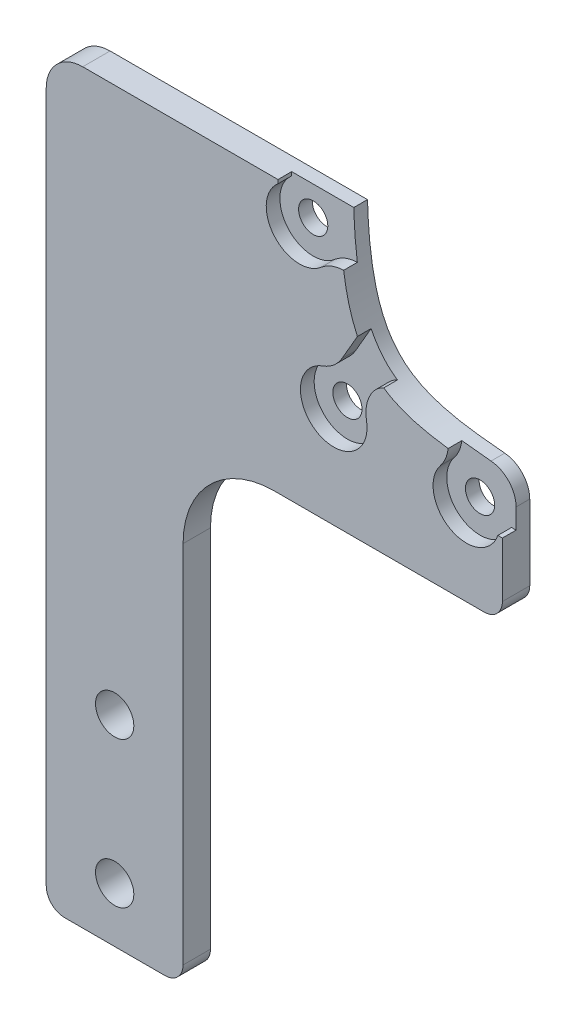
ISO-10303-21;
HEADER;
FILE_DESCRIPTION(('STEP AP214'),'2;1');
FILE_NAME('part.step','',(''),(''),'','','');
FILE_SCHEMA(('AUTOMOTIVE_DESIGN { 1 0 10303 214 1 1 1 1 }'));
ENDSEC;
DATA;
#1=APPLICATION_CONTEXT('core data for automotive mechanical design processes');
#2=APPLICATION_PROTOCOL_DEFINITION('international standard','automotive_design',2000,#1);
#3=PRODUCT_CONTEXT('',#1,'mechanical');
#4=PRODUCT('Part','Part','',(#3));
#5=PRODUCT_RELATED_PRODUCT_CATEGORY('part','',(#4));
#6=PRODUCT_DEFINITION_FORMATION('','',#4);
#7=PRODUCT_DEFINITION_CONTEXT('part definition',#1,'design');
#8=PRODUCT_DEFINITION('design','',#6,#7);
#9=PRODUCT_DEFINITION_SHAPE('','',#8);
#10=(LENGTH_UNIT() NAMED_UNIT(*) SI_UNIT(.MILLI.,.METRE.));
#11=(NAMED_UNIT(*) PLANE_ANGLE_UNIT() SI_UNIT($,.RADIAN.));
#12=(NAMED_UNIT(*) SI_UNIT($,.STERADIAN.) SOLID_ANGLE_UNIT());
#13=UNCERTAINTY_MEASURE_WITH_UNIT(LENGTH_MEASURE(1.E-05),#10,'distance_accuracy_value','');
#14=(GEOMETRIC_REPRESENTATION_CONTEXT(3) GLOBAL_UNCERTAINTY_ASSIGNED_CONTEXT((#13)) GLOBAL_UNIT_ASSIGNED_CONTEXT((#10,
#11,#12)) REPRESENTATION_CONTEXT('',''));
#15=CARTESIAN_POINT('',(0.,0.,0.));
#16=DIRECTION('',(0.,0.,1.));
#17=DIRECTION('',(1.,0.,0.));
#18=AXIS2_PLACEMENT_3D('',#15,#16,#17);
#19=CARTESIAN_POINT('',(-4.84810144085756,-0.321505966021562,-3.));
#20=CARTESIAN_POINT('',(-11.5337030803781,0.191019867929595,-3.));
#21=CARTESIAN_POINT('',(-20.1262235232757,0.876298033798934,-3.));
#22=CARTESIAN_POINT('',(-22.4429144832832,9.99430756418891,-3.));
#23=CARTESIAN_POINT('',(-22.6342920073783,16.445697007021,-3.));
#24=B_SPLINE_CURVE_WITH_KNOTS('',3,(#19,#20,#21,#22,#23),.UNSPECIFIED.,.F.,.F.,(4,1,4),(0.,
0.555464142141555,1.),.UNSPECIFIED.);
#25=DIRECTION('',(0.,0.,1.));
#26=VECTOR('',#25,1.);
#27=SURFACE_OF_LINEAR_EXTRUSION('',#24,#26);
#28=DIRECTION('',(0.,0.,1.));
#29=VECTOR('',#28,1.);
#30=CARTESIAN_POINT('',(-22.6342920073783,16.445697007021,-3.));
#31=LINE('',#30,#29);
#32=CARTESIAN_POINT('',(-22.6342920073783,16.445697007021,-3.));
#33=VERTEX_POINT('',#32);
#34=CARTESIAN_POINT('',(-22.6342920073783,16.445697007021,-1.5));
#35=VERTEX_POINT('',#34);
#36=EDGE_CURVE('E265',#33,#35,#31,.T.);
#37=ORIENTED_EDGE('',*,*,#36,.T.);
#38=CARTESIAN_POINT('',(-4.84810144085756,-0.321505966021562,-1.5));
#39=CARTESIAN_POINT('',(-11.5337030803781,0.191019867929595,-1.5));
#40=CARTESIAN_POINT('',(-20.1262235232757,0.876298033798934,-1.5));
#41=CARTESIAN_POINT('',(-22.4429144832832,9.99430756418891,-1.5));
#42=CARTESIAN_POINT('',(-22.6342920073783,16.445697007021,-1.5));
#43=B_SPLINE_CURVE_WITH_KNOTS('',3,(#38,#39,#40,#41,#42),.UNSPECIFIED.,.F.,.F.,(4,1,4),(0.,
0.555464142141555,1.),.UNSPECIFIED.);
#44=CARTESIAN_POINT('',(-22.2476020781494,11.4284929107981,-1.5));
#45=VERTEX_POINT('',#44);
#46=EDGE_CURVE('E340',#45,#35,#43,.T.);
#47=ORIENTED_EDGE('',*,*,#46,.F.);
#48=DIRECTION('',(0.,0.,1.));
#49=VECTOR('',#48,1.);
#50=CARTESIAN_POINT('',(-22.2476020781494,11.4284929107981,-3.));
#51=LINE('',#50,#49);
#52=CARTESIAN_POINT('',(-22.2476020781494,11.4284929107981,0.));
#53=VERTEX_POINT('',#52);
#54=EDGE_CURVE('E738',#53,#45,#51,.F.);
#55=ORIENTED_EDGE('',*,*,#54,.F.);
#56=CARTESIAN_POINT('',(-4.84810144085756,-0.321505966021562,0.));
#57=CARTESIAN_POINT('',(-11.5337030803781,0.191019867929595,0.));
#58=CARTESIAN_POINT('',(-20.1262235232757,0.876298033798934,0.));
#59=CARTESIAN_POINT('',(-22.4429144832832,9.99430756418891,0.));
#60=CARTESIAN_POINT('',(-22.6342920073783,16.445697007021,0.));
#61=B_SPLINE_CURVE_WITH_KNOTS('',3,(#56,#57,#58,#59,#60),.UNSPECIFIED.,.F.,.F.,(4,1,4),(0.,
0.555464142141555,1.),.UNSPECIFIED.);
#62=CARTESIAN_POINT('',(-20.7354963631146,5.90148701654422,0.));
#63=VERTEX_POINT('',#62);
#64=EDGE_CURVE('E248',#63,#53,#61,.T.);
#65=ORIENTED_EDGE('',*,*,#64,.F.);
#66=DIRECTION('',(0.,0.,1.));
#67=VECTOR('',#66,1.);
#68=CARTESIAN_POINT('',(-20.7354963682505,5.90148702716351,-3.));
#69=LINE('',#68,#67);
#70=CARTESIAN_POINT('',(-20.7354963715636,5.90148702142502,-1.5));
#71=VERTEX_POINT('',#70);
#72=EDGE_CURVE('E55',#71,#63,#69,.T.);
#73=ORIENTED_EDGE('',*,*,#72,.F.);
#74=CARTESIAN_POINT('',(-17.8551788077362,2.4588214028567,-1.5));
#75=VERTEX_POINT('',#74);
#76=EDGE_CURVE('E339',#75,#71,#43,.T.);
#77=ORIENTED_EDGE('',*,*,#76,.F.);
#78=DIRECTION('',(0.,0.,1.));
#79=VECTOR('',#78,1.);
#80=CARTESIAN_POINT('',(-17.8551788077362,2.4588214028567,-3.));
#81=LINE('',#80,#79);
#82=CARTESIAN_POINT('',(-17.8551788077362,2.4588214028567,0.));
#83=VERTEX_POINT('',#82);
#84=EDGE_CURVE('E741',#83,#75,#81,.F.);
#85=ORIENTED_EDGE('',*,*,#84,.F.);
#86=CARTESIAN_POINT('',(-10.7957714165131,0.235027934056742,0.));
#87=VERTEX_POINT('',#86);
#88=EDGE_CURVE('E243',#87,#83,#61,.T.);
#89=ORIENTED_EDGE('',*,*,#88,.F.);
#90=DIRECTION('',(0.,0.,1.));
#91=VECTOR('',#90,1.);
#92=CARTESIAN_POINT('',(-10.7957714165131,0.235027934056742,-3.));
#93=LINE('',#92,#91);
#94=CARTESIAN_POINT('',(-10.7957714165131,0.235027934056742,-1.5));
#95=VERTEX_POINT('',#94);
#96=EDGE_CURVE('E335',#95,#87,#93,.T.);
#97=ORIENTED_EDGE('',*,*,#96,.F.);
#98=CARTESIAN_POINT('',(-7.58987805858031,-0.102501025391033,-1.5));
#99=VERTEX_POINT('',#98);
#100=EDGE_CURVE('E324',#99,#95,#43,.T.);
#101=ORIENTED_EDGE('',*,*,#100,.F.);
#102=DIRECTION('',(0.,0.,1.));
#103=VECTOR('',#102,1.);
#104=CARTESIAN_POINT('',(-7.58987805858034,-0.10250102539103,0.));
#105=LINE('',#104,#103);
#106=CARTESIAN_POINT('',(-7.58987805858031,-0.102501025391033,-3.));
#107=VERTEX_POINT('',#106);
#108=EDGE_CURVE('E308',#99,#107,#105,.F.);
#109=ORIENTED_EDGE('',*,*,#108,.T.);
#110=EDGE_CURVE('E264',#107,#33,#24,.T.);
#111=ORIENTED_EDGE('',*,*,#110,.T.);
#112=EDGE_LOOP('',(#37,#47,#55,#65,#73,#77,#85,#89,#97,#101,#109,#111));
#113=FACE_BOUND('',#112,.T.);
#114=ADVANCED_FACE('F32',(#113),#27,.T.);
#115=CARTESIAN_POINT('',(-54.8481014408576,16.445697007021,-3.));
#116=DIRECTION('',(0.,1.,0.));
#117=DIRECTION('',(0.,0.,1.));
#118=AXIS2_PLACEMENT_3D('',#115,#116,#117);
#119=PLANE('',#118);
#120=DIRECTION('',(0.,0.,1.));
#121=VECTOR('',#120,1.);
#122=CARTESIAN_POINT('',(-29.4444367034377,16.445697007021,-3.));
#123=LINE('',#122,#121);
#124=CARTESIAN_POINT('',(-29.4444367034377,16.445697007021,-1.5));
#125=VERTEX_POINT('',#124);
#126=CARTESIAN_POINT('',(-29.4444367034377,16.445697007021,0.));
#127=VERTEX_POINT('',#126);
#128=EDGE_CURVE('E217',#125,#127,#123,.T.);
#129=ORIENTED_EDGE('',*,*,#128,.F.);
#130=DIRECTION('',(-1.,0.,0.));
#131=VECTOR('',#130,1.);
#132=CARTESIAN_POINT('',(-54.8481014408576,16.445697007021,-1.5));
#133=LINE('',#132,#131);
#134=EDGE_CURVE('E336',#35,#125,#133,.T.);
#135=ORIENTED_EDGE('',*,*,#134,.F.);
#136=ORIENTED_EDGE('',*,*,#36,.F.);
#137=DIRECTION('',(-1.,0.,0.));
#138=VECTOR('',#137,1.);
#139=CARTESIAN_POINT('',(-54.8481014408576,16.445697007021,-3.));
#140=LINE('',#139,#138);
#141=CARTESIAN_POINT('',(-50.8481014408576,16.445697007021,-3.));
#142=VERTEX_POINT('',#141);
#143=EDGE_CURVE('E365',#33,#142,#140,.T.);
#144=ORIENTED_EDGE('',*,*,#143,.T.);
#145=DIRECTION('',(0.,0.,1.));
#146=VECTOR('',#145,1.);
#147=CARTESIAN_POINT('',(-50.8481014408576,16.445697007021,-3.));
#148=LINE('',#147,#146);
#149=CARTESIAN_POINT('',(-50.8481014408576,16.445697007021,0.));
#150=VERTEX_POINT('',#149);
#151=EDGE_CURVE('E241',#142,#150,#148,.T.);
#152=ORIENTED_EDGE('',*,*,#151,.T.);
#153=DIRECTION('',(-1.,0.,0.));
#154=VECTOR('',#153,1.);
#155=CARTESIAN_POINT('',(-54.8481014408576,16.445697007021,0.));
#156=LINE('',#155,#154);
#157=EDGE_CURVE('E231',#127,#150,#156,.T.);
#158=ORIENTED_EDGE('',*,*,#157,.F.);
#159=EDGE_LOOP('',(#129,#135,#136,#144,#152,#158));
#160=FACE_BOUND('',#159,.T.);
#161=ADVANCED_FACE('F238',(#160),#119,.T.);
#162=CARTESIAN_POINT('',(-7.84810144085759,-3.09136714565224,-1.5));
#163=DIRECTION('',(0.,0.,1.));
#164=DIRECTION('',(1.,0.,0.));
#165=AXIS2_PLACEMENT_3D('',#162,#163,#164);
#166=CYLINDRICAL_SURFACE('',#165,3.);
#167=CARTESIAN_POINT('',(-7.84810144085759,-3.09136714565224,-1.5));
#168=DIRECTION('',(0.,0.,-1.));
#169=DIRECTION('',(-1.,0.,0.));
#170=AXIS2_PLACEMENT_3D('',#167,#168,#169);
#171=CIRCLE('',#170,3.);
#172=CARTESIAN_POINT('',(-4.84810144085759,-3.09136714565224,-1.5));
#173=VERTEX_POINT('',#172);
#174=EDGE_CURVE('E40',#173,#99,#171,.F.);
#175=ORIENTED_EDGE('',*,*,#174,.F.);
#176=DIRECTION('',(0.,0.,1.));
#177=VECTOR('',#176,1.);
#178=CARTESIAN_POINT('',(-4.84810144085759,-3.09136714565224,-3.));
#179=LINE('',#178,#177);
#180=CARTESIAN_POINT('',(-4.84810144085759,-3.09136714565224,-3.));
#181=VERTEX_POINT('',#180);
#182=EDGE_CURVE('E305',#181,#173,#179,.T.);
#183=ORIENTED_EDGE('',*,*,#182,.F.);
#184=CARTESIAN_POINT('',(-7.84810144085759,-3.09136714565224,-3.));
#185=DIRECTION('',(0.,0.,-1.));
#186=DIRECTION('',(-1.,0.,0.));
#187=AXIS2_PLACEMENT_3D('',#184,#185,#186);
#188=CIRCLE('',#187,3.);
#189=EDGE_CURVE('E310',#107,#181,#188,.T.);
#190=ORIENTED_EDGE('',*,*,#189,.F.);
#191=ORIENTED_EDGE('',*,*,#108,.F.);
#192=EDGE_LOOP('',(#175,#183,#190,#191));
#193=FACE_BOUND('',#192,.T.);
#194=ADVANCED_FACE('F342',(#193),#166,.T.);
#195=CARTESIAN_POINT('',(-18.2354484517116,2.73583518356467,0.));
#196=DIRECTION('',(0.,0.,-1.));
#197=DIRECTION('',(-1.,0.,0.));
#198=AXIS2_PLACEMENT_3D('',#195,#196,#197);
#199=PLANE('',#198);
#200=CARTESIAN_POINT('',(-47.3481014408576,-43.3215059660216,0.));
#201=DIRECTION('',(0.,0.,1.));
#202=DIRECTION('',(1.,0.,0.));
#203=AXIS2_PLACEMENT_3D('',#200,#201,#202);
#204=CIRCLE('',#203,2.1);
#205=CARTESIAN_POINT('',(-45.2481014408576,-43.3215059660216,0.));
#206=VERTEX_POINT('',#205);
#207=EDGE_CURVE('E745',#206,#206,#204,.T.);
#208=ORIENTED_EDGE('',*,*,#207,.F.);
#209=EDGE_LOOP('',(#208));
#210=FACE_BOUND('',#209,.T.);
#211=CARTESIAN_POINT('',(-47.3481014408576,-59.3215059660216,0.));
#212=DIRECTION('',(0.,0.,1.));
#213=DIRECTION('',(1.,0.,0.));
#214=AXIS2_PLACEMENT_3D('',#211,#212,#213);
#215=CIRCLE('',#214,2.1);
#216=CARTESIAN_POINT('',(-45.2481014408576,-59.3215059660216,0.));
#217=VERTEX_POINT('',#216);
#218=EDGE_CURVE('E744',#217,#217,#215,.T.);
#219=ORIENTED_EDGE('',*,*,#218,.F.);
#220=EDGE_LOOP('',(#219));
#221=FACE_BOUND('',#220,.T.);
#222=CARTESIAN_POINT('',(-27.0854447408347,13.255328812181,0.));
#223=DIRECTION('',(0.,0.,1.));
#224=DIRECTION('',(1.,0.,0.));
#225=AXIS2_PLACEMENT_3D('',#222,#223,#224);
#226=CIRCLE('',#225,3.65);
#227=CARTESIAN_POINT('',(-29.4444367034377,16.0405858775835,0.));
#228=VERTEX_POINT('',#227);
#229=CARTESIAN_POINT('',(-24.7193765845861,10.476080446168,0.));
#230=VERTEX_POINT('',#229);
#231=EDGE_CURVE('E234',#228,#230,#226,.T.);
#232=ORIENTED_EDGE('',*,*,#231,.F.);
#233=DIRECTION('',(0.,-1.,0.));
#234=VECTOR('',#233,1.);
#235=CARTESIAN_POINT('',(-29.4444367034377,18.394175393091,0.));
#236=LINE('',#235,#234);
#237=EDGE_CURVE('E220',#127,#228,#236,.T.);
#238=ORIENTED_EDGE('',*,*,#237,.F.);
#239=ORIENTED_EDGE('',*,*,#157,.T.);
#240=CARTESIAN_POINT('',(-50.8481014408576,12.445697007021,0.));
#241=DIRECTION('',(0.,0.,-1.));
#242=DIRECTION('',(-1.,0.,0.));
#243=AXIS2_PLACEMENT_3D('',#240,#241,#242);
#244=CIRCLE('',#243,4.);
#245=CARTESIAN_POINT('',(-54.8481014408576,12.445697007021,0.));
#246=VERTEX_POINT('',#245);
#247=EDGE_CURVE('E299',#150,#246,#244,.F.);
#248=ORIENTED_EDGE('',*,*,#247,.T.);
#249=DIRECTION('',(0.,-1.,0.));
#250=VECTOR('',#249,1.);
#251=CARTESIAN_POINT('',(-54.8481014408576,-65.3215059660216,0.));
#252=LINE('',#251,#250);
#253=CARTESIAN_POINT('',(-54.8481014408576,-63.3215059660216,0.));
#254=VERTEX_POINT('',#253);
#255=EDGE_CURVE('E242',#246,#254,#252,.T.);
#256=ORIENTED_EDGE('',*,*,#255,.T.);
#257=CARTESIAN_POINT('',(-52.8481014408576,-63.3215059660216,0.));
#258=DIRECTION('',(0.,0.,-1.));
#259=DIRECTION('',(-1.,0.,0.));
#260=AXIS2_PLACEMENT_3D('',#257,#258,#259);
#261=CIRCLE('',#260,2.);
#262=CARTESIAN_POINT('',(-52.8481014408576,-65.3215059660216,0.));
#263=VERTEX_POINT('',#262);
#264=EDGE_CURVE('E276',#254,#263,#261,.F.);
#265=ORIENTED_EDGE('',*,*,#264,.T.);
#266=DIRECTION('',(1.,0.,0.));
#267=VECTOR('',#266,1.);
#268=CARTESIAN_POINT('',(-39.8481014408576,-65.3215059660216,0.));
#269=LINE('',#268,#267);
#270=CARTESIAN_POINT('',(-41.8481014408576,-65.3215059660216,0.));
#271=VERTEX_POINT('',#270);
#272=EDGE_CURVE('E245',#263,#271,#269,.T.);
#273=ORIENTED_EDGE('',*,*,#272,.T.);
#274=CARTESIAN_POINT('',(-41.8481014408576,-63.3215059660216,0.));
#275=DIRECTION('',(0.,0.,-1.));
#276=DIRECTION('',(-1.,0.,0.));
#277=AXIS2_PLACEMENT_3D('',#274,#275,#276);
#278=CIRCLE('',#277,2.);
#279=CARTESIAN_POINT('',(-39.8481014408576,-63.3215059660216,0.));
#280=VERTEX_POINT('',#279);
#281=EDGE_CURVE('E274',#271,#280,#278,.F.);
#282=ORIENTED_EDGE('',*,*,#281,.T.);
#283=DIRECTION('',(0.,1.,0.));
#284=VECTOR('',#283,1.);
#285=CARTESIAN_POINT('',(-39.8481014408576,-13.3215059660216,0.));
#286=LINE('',#285,#284);
#287=CARTESIAN_POINT('',(-39.8481014408576,-23.3215059660216,0.));
#288=VERTEX_POINT('',#287);
#289=EDGE_CURVE('E256',#280,#288,#286,.T.);
#290=ORIENTED_EDGE('',*,*,#289,.T.);
#291=CARTESIAN_POINT('',(-29.8481014408576,-23.3215059660216,0.));
#292=DIRECTION('',(0.,0.,-1.));
#293=DIRECTION('',(-1.,0.,0.));
#294=AXIS2_PLACEMENT_3D('',#291,#292,#293);
#295=CIRCLE('',#294,10.);
#296=CARTESIAN_POINT('',(-29.8481014408576,-13.3215059660216,0.));
#297=VERTEX_POINT('',#296);
#298=EDGE_CURVE('E317',#288,#297,#295,.T.);
#299=ORIENTED_EDGE('',*,*,#298,.T.);
#300=DIRECTION('',(1.,0.,0.));
#301=VECTOR('',#300,1.);
#302=CARTESIAN_POINT('',(-4.84810144085759,-13.3215059660216,0.));
#303=LINE('',#302,#301);
#304=CARTESIAN_POINT('',(-6.84810144085759,-13.3215059660216,0.));
#305=VERTEX_POINT('',#304);
#306=EDGE_CURVE('E259',#297,#305,#303,.T.);
#307=ORIENTED_EDGE('',*,*,#306,.T.);
#308=CARTESIAN_POINT('',(-6.84810144085759,-11.3215059660216,0.));
#309=DIRECTION('',(0.,0.,-1.));
#310=DIRECTION('',(-1.,0.,0.));
#311=AXIS2_PLACEMENT_3D('',#308,#309,#310);
#312=CIRCLE('',#311,2.);
#313=CARTESIAN_POINT('',(-4.84810144085759,-11.3215059660216,0.));
#314=VERTEX_POINT('',#313);
#315=EDGE_CURVE('E272',#305,#314,#312,.F.);
#316=ORIENTED_EDGE('',*,*,#315,.T.);
#317=DIRECTION('',(0.,1.,0.));
#318=VECTOR('',#317,1.);
#319=CARTESIAN_POINT('',(-4.84810144085759,-13.3215059660216,0.));
#320=LINE('',#319,#318);
#321=CARTESIAN_POINT('',(-4.84810144085759,-5.29170051109418,0.));
#322=VERTEX_POINT('',#321);
#323=EDGE_CURVE('E261',#314,#322,#320,.T.);
#324=ORIENTED_EDGE('',*,*,#323,.T.);
#325=DIRECTION('',(1.,0.,0.));
#326=VECTOR('',#325,1.);
#327=CARTESIAN_POINT('',(-7.34567970411248,-5.29170051109418,0.));
#328=LINE('',#327,#326);
#329=CARTESIAN_POINT('',(-5.34695507696509,-5.29170051109418,0.));
#330=VERTEX_POINT('',#329);
#331=EDGE_CURVE('E657',#330,#322,#328,.T.);
#332=ORIENTED_EDGE('',*,*,#331,.F.);
#333=CARTESIAN_POINT('',(-8.79590479221229,-4.09702655486332,0.));
#334=DIRECTION('',(0.,0.,1.));
#335=DIRECTION('',(1.,0.,0.));
#336=AXIS2_PLACEMENT_3D('',#333,#334,#335);
#337=CIRCLE('',#336,3.65);
#338=CARTESIAN_POINT('',(-11.6467314308517,-1.81770922802532,0.));
#339=VERTEX_POINT('',#338);
#340=EDGE_CURVE('E668',#339,#330,#337,.T.);
#341=ORIENTED_EDGE('',*,*,#340,.F.);
#342=CARTESIAN_POINT('',(-14.7709250074428,0.680172773988936,0.));
#343=DIRECTION('',(0.,0.,-1.));
#344=DIRECTION('',(-1.,0.,0.));
#345=AXIS2_PLACEMENT_3D('',#342,#343,#344);
#346=CIRCLE('',#345,4.);
#347=EDGE_CURVE('E713',#87,#339,#346,.T.);
#348=ORIENTED_EDGE('',*,*,#347,.F.);
#349=ORIENTED_EDGE('',*,*,#88,.T.);
#350=CARTESIAN_POINT('',(-16.6237758081897,-0.276804056285675,0.));
#351=DIRECTION('',(0.,0.,-1.));
#352=DIRECTION('',(1.,0.,0.));
#353=AXIS2_PLACEMENT_3D('',#350,#351,#352);
#354=CIRCLE('',#353,3.);
#355=CARTESIAN_POINT('',(-19.221852019543,1.22319594371431,0.));
#356=VERTEX_POINT('',#355);
#357=EDGE_CURVE('E711',#356,#83,#354,.T.);
#358=ORIENTED_EDGE('',*,*,#357,.F.);
#359=DIRECTION('',(0.499999999999993,0.866025403784443,0.));
#360=VECTOR('',#359,1.);
#361=CARTESIAN_POINT('',(-19.2729439389982,1.13470214336173,0.));
#362=LINE('',#361,#360);
#363=CARTESIAN_POINT('',(-19.2729439389982,1.13470214336173,0.));
#364=VERTEX_POINT('',#363);
#365=EDGE_CURVE('E708',#364,#356,#362,.T.);
#366=ORIENTED_EDGE('',*,*,#365,.F.);
#367=CARTESIAN_POINT('',(-15.8088423238604,-0.865297856638261,0.));
#368=DIRECTION('',(0.,0.,-1.));
#369=DIRECTION('',(-1.,0.,0.));
#370=AXIS2_PLACEMENT_3D('',#367,#368,#369);
#371=CIRCLE('',#370,4.);
#372=CARTESIAN_POINT('',(-19.7430163145651,-1.58798382638093,0.));
#373=VERTEX_POINT('',#372);
#374=EDGE_CURVE('E705',#373,#364,#371,.T.);
#375=ORIENTED_EDGE('',*,*,#374,.F.);
#376=CARTESIAN_POINT('',(-23.3329500810831,-2.24743477377112,0.));
#377=DIRECTION('',(0.,0.,1.));
#378=DIRECTION('',(1.,0.,0.));
#379=AXIS2_PLACEMENT_3D('',#376,#377,#378);
#380=CIRCLE('',#379,3.65);
#381=CARTESIAN_POINT('',(-24.5568156913525,1.19126453963211,0.));
#382=VERTEX_POINT('',#381);
#383=EDGE_CURVE('E702',#382,#373,#380,.T.);
#384=ORIENTED_EDGE('',*,*,#383,.F.);
#385=CARTESIAN_POINT('',(-25.8980382779492,4.95970214336168,0.));
#386=DIRECTION('',(0.,0.,-1.));
#387=DIRECTION('',(-1.,0.,0.));
#388=AXIS2_PLACEMENT_3D('',#385,#386,#387);
#389=CIRCLE('',#388,4.);
#390=CARTESIAN_POINT('',(-22.4339366628114,2.9597021433617,0.));
#391=VERTEX_POINT('',#390);
#392=EDGE_CURVE('E699',#391,#382,#389,.T.);
#393=ORIENTED_EDGE('',*,*,#392,.F.);
#394=DIRECTION('',(-0.499999999999994,-0.866025403784442,0.));
#395=VECTOR('',#394,1.);
#396=CARTESIAN_POINT('',(-19.6837322348947,7.72319594371432,0.));
#397=LINE('',#396,#395);
#398=EDGE_CURVE('E697',#63,#391,#397,.T.);
#399=ORIENTED_EDGE('',*,*,#398,.F.);
#400=ORIENTED_EDGE('',*,*,#64,.T.);
#401=CARTESIAN_POINT('',(-22.126425180478,7.43032881218104,0.));
#402=DIRECTION('',(0.,0.,-1.));
#403=DIRECTION('',(1.,0.,0.));
#404=AXIS2_PLACEMENT_3D('',#401,#402,#403);
#405=CIRCLE('',#404,4.);
#406=EDGE_CURVE('E695',#230,#53,#405,.T.);
#407=ORIENTED_EDGE('',*,*,#406,.F.);
#408=EDGE_LOOP('',(#232,#238,#239,#248,#256,#265,#273,#282,#290,#299,#307,#316,#324,#332,#341,
#348,#349,#358,#366,#375,#384,#393,#399,#400,#407));
#409=FACE_BOUND('',#408,.T.);
#410=ADVANCED_FACE('F230',(#210,#221,#409),#199,.F.);
#411=CARTESIAN_POINT('',(-4.84810144085759,-13.3215059660216,-3.));
#412=DIRECTION('',(1.,0.,0.));
#413=DIRECTION('',(0.,1.,0.));
#414=AXIS2_PLACEMENT_3D('',#411,#412,#413);
#415=PLANE('',#414);
#416=DIRECTION('',(0.,0.,-1.));
#417=VECTOR('',#416,1.);
#418=CARTESIAN_POINT('',(-4.84810144085759,-5.29170051109418,-3.));
#419=LINE('',#418,#417);
#420=CARTESIAN_POINT('',(-4.84810144085759,-5.29170051109418,-1.5));
#421=VERTEX_POINT('',#420);
#422=EDGE_CURVE('E663',#322,#421,#419,.T.);
#423=ORIENTED_EDGE('',*,*,#422,.F.);
#424=ORIENTED_EDGE('',*,*,#323,.F.);
#425=DIRECTION('',(0.,0.,1.));
#426=VECTOR('',#425,1.);
#427=CARTESIAN_POINT('',(-4.84810144085759,-11.3215059660216,-3.));
#428=LINE('',#427,#426);
#429=CARTESIAN_POINT('',(-4.84810144085759,-11.3215059660216,-3.));
#430=VERTEX_POINT('',#429);
#431=EDGE_CURVE('E296',#314,#430,#428,.F.);
#432=ORIENTED_EDGE('',*,*,#431,.T.);
#433=DIRECTION('',(0.,1.,0.));
#434=VECTOR('',#433,1.);
#435=CARTESIAN_POINT('',(-4.84810144085759,-13.3215059660216,-3.));
#436=LINE('',#435,#434);
#437=EDGE_CURVE('E269',#430,#181,#436,.T.);
#438=ORIENTED_EDGE('',*,*,#437,.T.);
#439=ORIENTED_EDGE('',*,*,#182,.T.);
#440=DIRECTION('',(0.,-1.,0.));
#441=VECTOR('',#440,1.);
#442=CARTESIAN_POINT('',(-4.84810144085759,-13.3215059660216,-1.5));
#443=LINE('',#442,#441);
#444=EDGE_CURVE('E225',#173,#421,#443,.T.);
#445=ORIENTED_EDGE('',*,*,#444,.T.);
#446=EDGE_LOOP('',(#423,#424,#432,#438,#439,#445));
#447=FACE_BOUND('',#446,.T.);
#448=ADVANCED_FACE('F351',(#447),#415,.T.);
#449=CARTESIAN_POINT('',(-4.84810144085759,-13.3215059660216,-3.));
#450=DIRECTION('',(0.,-1.,0.));
#451=DIRECTION('',(1.,0.,0.));
#452=AXIS2_PLACEMENT_3D('',#449,#450,#451);
#453=PLANE('',#452);
#454=ORIENTED_EDGE('',*,*,#306,.F.);
#455=DIRECTION('',(0.,0.,1.));
#456=VECTOR('',#455,1.);
#457=CARTESIAN_POINT('',(-29.8481014408576,-13.3215059660216,-3.));
#458=LINE('',#457,#456);
#459=CARTESIAN_POINT('',(-29.8481014408576,-13.3215059660216,-3.));
#460=VERTEX_POINT('',#459);
#461=EDGE_CURVE('E315',#297,#460,#458,.F.);
#462=ORIENTED_EDGE('',*,*,#461,.T.);
#463=DIRECTION('',(1.,0.,0.));
#464=VECTOR('',#463,1.);
#465=CARTESIAN_POINT('',(-4.84810144085759,-13.3215059660216,-3.));
#466=LINE('',#465,#464);
#467=CARTESIAN_POINT('',(-6.84810144085759,-13.3215059660216,-3.));
#468=VERTEX_POINT('',#467);
#469=EDGE_CURVE('E354',#460,#468,#466,.T.);
#470=ORIENTED_EDGE('',*,*,#469,.T.);
#471=DIRECTION('',(0.,0.,1.));
#472=VECTOR('',#471,1.);
#473=CARTESIAN_POINT('',(-6.84810144085759,-13.3215059660216,-3.));
#474=LINE('',#473,#472);
#475=EDGE_CURVE('E293',#468,#305,#474,.T.);
#476=ORIENTED_EDGE('',*,*,#475,.T.);
#477=EDGE_LOOP('',(#454,#462,#470,#476));
#478=FACE_BOUND('',#477,.T.);
#479=ADVANCED_FACE('F528',(#478),#453,.T.);
#480=CARTESIAN_POINT('',(-39.8481014408576,-13.3215059660216,-3.));
#481=DIRECTION('',(1.,0.,0.));
#482=DIRECTION('',(0.,1.,0.));
#483=AXIS2_PLACEMENT_3D('',#480,#481,#482);
#484=PLANE('',#483);
#485=DIRECTION('',(0.,1.,0.));
#486=VECTOR('',#485,1.);
#487=CARTESIAN_POINT('',(-39.8481014408576,-13.3215059660216,-3.));
#488=LINE('',#487,#486);
#489=CARTESIAN_POINT('',(-39.8481014408576,-63.3215059660216,-3.));
#490=VERTEX_POINT('',#489);
#491=CARTESIAN_POINT('',(-39.8481014408576,-23.3215059660216,-3.));
#492=VERTEX_POINT('',#491);
#493=EDGE_CURVE('E355',#490,#492,#488,.T.);
#494=ORIENTED_EDGE('',*,*,#493,.T.);
#495=DIRECTION('',(0.,0.,1.));
#496=VECTOR('',#495,1.);
#497=CARTESIAN_POINT('',(-39.8481014408576,-23.3215059660216,0.));
#498=LINE('',#497,#496);
#499=EDGE_CURVE('E312',#492,#288,#498,.T.);
#500=ORIENTED_EDGE('',*,*,#499,.T.);
#501=ORIENTED_EDGE('',*,*,#289,.F.);
#502=DIRECTION('',(0.,0.,1.));
#503=VECTOR('',#502,1.);
#504=CARTESIAN_POINT('',(-39.8481014408576,-63.3215059660216,-3.));
#505=LINE('',#504,#503);
#506=EDGE_CURVE('E291',#280,#490,#505,.F.);
#507=ORIENTED_EDGE('',*,*,#506,.T.);
#508=EDGE_LOOP('',(#494,#500,#501,#507));
#509=FACE_BOUND('',#508,.T.);
#510=ADVANCED_FACE('F522',(#509),#484,.T.);
#511=CARTESIAN_POINT('',(-39.8481014408576,-65.3215059660216,-3.));
#512=DIRECTION('',(0.,-1.,0.));
#513=DIRECTION('',(0.,0.,-1.));
#514=AXIS2_PLACEMENT_3D('',#511,#512,#513);
#515=PLANE('',#514);
#516=ORIENTED_EDGE('',*,*,#272,.F.);
#517=DIRECTION('',(0.,0.,1.));
#518=VECTOR('',#517,1.);
#519=CARTESIAN_POINT('',(-52.8481014408576,-65.3215059660216,-3.));
#520=LINE('',#519,#518);
#521=CARTESIAN_POINT('',(-52.8481014408576,-65.3215059660216,-3.));
#522=VERTEX_POINT('',#521);
#523=EDGE_CURVE('E281',#263,#522,#520,.F.);
#524=ORIENTED_EDGE('',*,*,#523,.T.);
#525=DIRECTION('',(1.,0.,0.));
#526=VECTOR('',#525,1.);
#527=CARTESIAN_POINT('',(-39.8481014408576,-65.3215059660216,-3.));
#528=LINE('',#527,#526);
#529=CARTESIAN_POINT('',(-41.8481014408576,-65.3215059660216,-3.));
#530=VERTEX_POINT('',#529);
#531=EDGE_CURVE('E360',#522,#530,#528,.T.);
#532=ORIENTED_EDGE('',*,*,#531,.T.);
#533=DIRECTION('',(0.,0.,1.));
#534=VECTOR('',#533,1.);
#535=CARTESIAN_POINT('',(-41.8481014408576,-65.3215059660216,-3.));
#536=LINE('',#535,#534);
#537=EDGE_CURVE('E278',#530,#271,#536,.T.);
#538=ORIENTED_EDGE('',*,*,#537,.T.);
#539=EDGE_LOOP('',(#516,#524,#532,#538));
#540=FACE_BOUND('',#539,.T.);
#541=ADVANCED_FACE('F527',(#540),#515,.T.);
#542=CARTESIAN_POINT('',(-54.8481014408576,-65.3215059660216,-3.));
#543=DIRECTION('',(-1.,0.,0.));
#544=DIRECTION('',(0.,0.,1.));
#545=AXIS2_PLACEMENT_3D('',#542,#543,#544);
#546=PLANE('',#545);
#547=ORIENTED_EDGE('',*,*,#255,.F.);
#548=DIRECTION('',(0.,0.,1.));
#549=VECTOR('',#548,1.);
#550=CARTESIAN_POINT('',(-54.8481014408576,12.445697007021,-3.));
#551=LINE('',#550,#549);
#552=CARTESIAN_POINT('',(-54.8481014408576,12.445697007021,-3.));
#553=VERTEX_POINT('',#552);
#554=EDGE_CURVE('E301',#246,#553,#551,.F.);
#555=ORIENTED_EDGE('',*,*,#554,.T.);
#556=DIRECTION('',(0.,-1.,0.));
#557=VECTOR('',#556,1.);
#558=CARTESIAN_POINT('',(-54.8481014408576,-65.3215059660216,-3.));
#559=LINE('',#558,#557);
#560=CARTESIAN_POINT('',(-54.8481014408576,-63.3215059660216,-3.));
#561=VERTEX_POINT('',#560);
#562=EDGE_CURVE('E363',#553,#561,#559,.T.);
#563=ORIENTED_EDGE('',*,*,#562,.T.);
#564=DIRECTION('',(0.,0.,1.));
#565=VECTOR('',#564,1.);
#566=CARTESIAN_POINT('',(-54.8481014408576,-63.3215059660216,-3.));
#567=LINE('',#566,#565);
#568=EDGE_CURVE('E268',#561,#254,#567,.T.);
#569=ORIENTED_EDGE('',*,*,#568,.T.);
#570=EDGE_LOOP('',(#547,#555,#563,#569));
#571=FACE_BOUND('',#570,.T.);
#572=ADVANCED_FACE('F554',(#571),#546,.T.);
#573=CARTESIAN_POINT('',(-18.2354484517116,2.73583518356467,-3.));
#574=DIRECTION('',(0.,0.,-1.));
#575=DIRECTION('',(-1.,0.,0.));
#576=AXIS2_PLACEMENT_3D('',#573,#574,#575);
#577=PLANE('',#576);
#578=CARTESIAN_POINT('',(-27.0854447408347,13.255328812181,-3.));
#579=DIRECTION('',(0.,0.,-1.));
#580=DIRECTION('',(-1.,0.,0.));
#581=AXIS2_PLACEMENT_3D('',#578,#579,#580);
#582=CIRCLE('',#581,1.6);
#583=CARTESIAN_POINT('',(-28.6854447408347,13.255328812181,-3.));
#584=VERTEX_POINT('',#583);
#585=EDGE_CURVE('E637',#584,#584,#582,.T.);
#586=ORIENTED_EDGE('',*,*,#585,.F.);
#587=EDGE_LOOP('',(#586));
#588=FACE_BOUND('',#587,.T.);
#589=CARTESIAN_POINT('',(-23.3329500810831,-2.24743477377112,-3.));
#590=DIRECTION('',(0.,0.,-1.));
#591=DIRECTION('',(-1.,0.,0.));
#592=AXIS2_PLACEMENT_3D('',#589,#590,#591);
#593=CIRCLE('',#592,1.6);
#594=CARTESIAN_POINT('',(-24.9329500810831,-2.24743477377112,-3.));
#595=VERTEX_POINT('',#594);
#596=EDGE_CURVE('E642',#595,#595,#593,.T.);
#597=ORIENTED_EDGE('',*,*,#596,.F.);
#598=EDGE_LOOP('',(#597));
#599=FACE_BOUND('',#598,.T.);
#600=CARTESIAN_POINT('',(-8.79590479221229,-4.09702655486332,-3.));
#601=DIRECTION('',(0.,0.,-1.));
#602=DIRECTION('',(-1.,0.,0.));
#603=AXIS2_PLACEMENT_3D('',#600,#601,#602);
#604=CIRCLE('',#603,1.6);
#605=CARTESIAN_POINT('',(-10.3959047922123,-4.09702655486332,-3.));
#606=VERTEX_POINT('',#605);
#607=EDGE_CURVE('E654',#606,#606,#604,.T.);
#608=ORIENTED_EDGE('',*,*,#607,.F.);
#609=EDGE_LOOP('',(#608));
#610=FACE_BOUND('',#609,.T.);
#611=CARTESIAN_POINT('',(-47.3481014408576,-43.3215059660216,-3.));
#612=DIRECTION('',(0.,0.,-1.));
#613=DIRECTION('',(-1.,0.,0.));
#614=AXIS2_PLACEMENT_3D('',#611,#612,#613);
#615=CIRCLE('',#614,2.1);
#616=CARTESIAN_POINT('',(-49.4481014408576,-43.3215059660216,-3.));
#617=VERTEX_POINT('',#616);
#618=EDGE_CURVE('E371',#617,#617,#615,.T.);
#619=ORIENTED_EDGE('',*,*,#618,.F.);
#620=EDGE_LOOP('',(#619));
#621=FACE_BOUND('',#620,.T.);
#622=CARTESIAN_POINT('',(-47.3481014408576,-59.3215059660216,-3.));
#623=DIRECTION('',(0.,0.,-1.));
#624=DIRECTION('',(-1.,0.,0.));
#625=AXIS2_PLACEMENT_3D('',#622,#623,#624);
#626=CIRCLE('',#625,2.1);
#627=CARTESIAN_POINT('',(-49.4481014408576,-59.3215059660216,-3.));
#628=VERTEX_POINT('',#627);
#629=EDGE_CURVE('E748',#628,#628,#626,.T.);
#630=ORIENTED_EDGE('',*,*,#629,.F.);
#631=EDGE_LOOP('',(#630));
#632=FACE_BOUND('',#631,.T.);
#633=ORIENTED_EDGE('',*,*,#110,.F.);
#634=ORIENTED_EDGE('',*,*,#189,.T.);
#635=ORIENTED_EDGE('',*,*,#437,.F.);
#636=CARTESIAN_POINT('',(-6.84810144085759,-11.3215059660216,-3.));
#637=DIRECTION('',(0.,0.,-1.));
#638=DIRECTION('',(-1.,0.,0.));
#639=AXIS2_PLACEMENT_3D('',#636,#637,#638);
#640=CIRCLE('',#639,2.);
#641=EDGE_CURVE('E283',#430,#468,#640,.T.);
#642=ORIENTED_EDGE('',*,*,#641,.T.);
#643=ORIENTED_EDGE('',*,*,#469,.F.);
#644=CARTESIAN_POINT('',(-29.8481014408576,-23.3215059660216,-3.));
#645=DIRECTION('',(0.,0.,-1.));
#646=DIRECTION('',(-1.,0.,0.));
#647=AXIS2_PLACEMENT_3D('',#644,#645,#646);
#648=CIRCLE('',#647,10.);
#649=EDGE_CURVE('E319',#460,#492,#648,.F.);
#650=ORIENTED_EDGE('',*,*,#649,.T.);
#651=ORIENTED_EDGE('',*,*,#493,.F.);
#652=CARTESIAN_POINT('',(-41.8481014408576,-63.3215059660216,-3.));
#653=DIRECTION('',(0.,0.,-1.));
#654=DIRECTION('',(-1.,0.,0.));
#655=AXIS2_PLACEMENT_3D('',#652,#653,#654);
#656=CIRCLE('',#655,2.);
#657=EDGE_CURVE('E286',#490,#530,#656,.T.);
#658=ORIENTED_EDGE('',*,*,#657,.T.);
#659=ORIENTED_EDGE('',*,*,#531,.F.);
#660=CARTESIAN_POINT('',(-52.8481014408576,-63.3215059660216,-3.));
#661=DIRECTION('',(0.,0.,-1.));
#662=DIRECTION('',(-1.,0.,0.));
#663=AXIS2_PLACEMENT_3D('',#660,#661,#662);
#664=CIRCLE('',#663,2.);
#665=EDGE_CURVE('E288',#522,#561,#664,.T.);
#666=ORIENTED_EDGE('',*,*,#665,.T.);
#667=ORIENTED_EDGE('',*,*,#562,.F.);
#668=CARTESIAN_POINT('',(-50.8481014408576,12.445697007021,-3.));
#669=DIRECTION('',(0.,0.,-1.));
#670=DIRECTION('',(-1.,0.,0.));
#671=AXIS2_PLACEMENT_3D('',#668,#669,#670);
#672=CIRCLE('',#671,4.);
#673=EDGE_CURVE('E303',#553,#142,#672,.T.);
#674=ORIENTED_EDGE('',*,*,#673,.T.);
#675=ORIENTED_EDGE('',*,*,#143,.F.);
#676=EDGE_LOOP('',(#633,#634,#635,#642,#643,#650,#651,#658,#659,#666,#667,#674,#675));
#677=FACE_BOUND('',#676,.T.);
#678=ADVANCED_FACE('F346',(#588,#599,#610,#621,#632,#677),#577,.T.);
#679=CARTESIAN_POINT('',(-52.8481014408576,-63.3215059660216,-3.));
#680=DIRECTION('',(0.,0.,1.));
#681=DIRECTION('',(1.,0.,0.));
#682=AXIS2_PLACEMENT_3D('',#679,#680,#681);
#683=CYLINDRICAL_SURFACE('',#682,2.);
#684=ORIENTED_EDGE('',*,*,#665,.F.);
#685=ORIENTED_EDGE('',*,*,#523,.F.);
#686=ORIENTED_EDGE('',*,*,#264,.F.);
#687=ORIENTED_EDGE('',*,*,#568,.F.);
#688=EDGE_LOOP('',(#684,#685,#686,#687));
#689=FACE_BOUND('',#688,.T.);
#690=ADVANCED_FACE('F381',(#689),#683,.T.);
#691=CARTESIAN_POINT('',(-41.8481014408576,-63.3215059660216,-3.));
#692=DIRECTION('',(0.,0.,1.));
#693=DIRECTION('',(1.,0.,0.));
#694=AXIS2_PLACEMENT_3D('',#691,#692,#693);
#695=CYLINDRICAL_SURFACE('',#694,2.);
#696=ORIENTED_EDGE('',*,*,#657,.F.);
#697=ORIENTED_EDGE('',*,*,#506,.F.);
#698=ORIENTED_EDGE('',*,*,#281,.F.);
#699=ORIENTED_EDGE('',*,*,#537,.F.);
#700=EDGE_LOOP('',(#696,#697,#698,#699));
#701=FACE_BOUND('',#700,.T.);
#702=ADVANCED_FACE('F384',(#701),#695,.T.);
#703=CARTESIAN_POINT('',(-6.84810144085759,-11.3215059660216,-3.));
#704=DIRECTION('',(0.,0.,1.));
#705=DIRECTION('',(1.,0.,0.));
#706=AXIS2_PLACEMENT_3D('',#703,#704,#705);
#707=CYLINDRICAL_SURFACE('',#706,2.);
#708=ORIENTED_EDGE('',*,*,#641,.F.);
#709=ORIENTED_EDGE('',*,*,#431,.F.);
#710=ORIENTED_EDGE('',*,*,#315,.F.);
#711=ORIENTED_EDGE('',*,*,#475,.F.);
#712=EDGE_LOOP('',(#708,#709,#710,#711));
#713=FACE_BOUND('',#712,.T.);
#714=ADVANCED_FACE('F388',(#713),#707,.T.);
#715=CARTESIAN_POINT('',(-47.3481014408576,-59.3215059660216,-10.));
#716=DIRECTION('',(0.,0.,1.));
#717=DIRECTION('',(1.,0.,0.));
#718=AXIS2_PLACEMENT_3D('',#715,#716,#717);
#719=CYLINDRICAL_SURFACE('',#718,2.1);
#720=ORIENTED_EDGE('',*,*,#629,.T.);
#721=EDGE_LOOP('',(#720));
#722=FACE_BOUND('',#721,.T.);
#723=ORIENTED_EDGE('',*,*,#218,.T.);
#724=EDGE_LOOP('',(#723));
#725=FACE_BOUND('',#724,.T.);
#726=ADVANCED_FACE('F392',(#722,#725),#719,.F.);
#727=CARTESIAN_POINT('',(-47.3481014408576,-43.3215059660216,-10.));
#728=DIRECTION('',(0.,0.,1.));
#729=DIRECTION('',(1.,0.,0.));
#730=AXIS2_PLACEMENT_3D('',#727,#728,#729);
#731=CYLINDRICAL_SURFACE('',#730,2.1);
#732=ORIENTED_EDGE('',*,*,#618,.T.);
#733=EDGE_LOOP('',(#732));
#734=FACE_BOUND('',#733,.T.);
#735=ORIENTED_EDGE('',*,*,#207,.T.);
#736=EDGE_LOOP('',(#735));
#737=FACE_BOUND('',#736,.T.);
#738=ADVANCED_FACE('F396',(#734,#737),#731,.F.);
#739=CARTESIAN_POINT('',(-50.8481014408576,12.445697007021,-3.));
#740=DIRECTION('',(0.,0.,1.));
#741=DIRECTION('',(1.,0.,0.));
#742=AXIS2_PLACEMENT_3D('',#739,#740,#741);
#743=CYLINDRICAL_SURFACE('',#742,4.);
#744=ORIENTED_EDGE('',*,*,#673,.F.);
#745=ORIENTED_EDGE('',*,*,#554,.F.);
#746=ORIENTED_EDGE('',*,*,#247,.F.);
#747=ORIENTED_EDGE('',*,*,#151,.F.);
#748=EDGE_LOOP('',(#744,#745,#746,#747));
#749=FACE_BOUND('',#748,.T.);
#750=ADVANCED_FACE('F394',(#749),#743,.T.);
#751=CARTESIAN_POINT('',(-29.8481014408576,-23.3215059660216,-3.));
#752=DIRECTION('',(0.,0.,-1.));
#753=DIRECTION('',(-1.,0.,0.));
#754=AXIS2_PLACEMENT_3D('',#751,#752,#753);
#755=CYLINDRICAL_SURFACE('',#754,10.);
#756=ORIENTED_EDGE('',*,*,#649,.F.);
#757=ORIENTED_EDGE('',*,*,#461,.F.);
#758=ORIENTED_EDGE('',*,*,#298,.F.);
#759=ORIENTED_EDGE('',*,*,#499,.F.);
#760=EDGE_LOOP('',(#756,#757,#758,#759));
#761=FACE_BOUND('',#760,.T.);
#762=ADVANCED_FACE('F34',(#761),#755,.F.);
#763=CARTESIAN_POINT('',(-15.0186410463161,21.5765901149766,-1.5));
#764=DIRECTION('',(0.,0.,-1.));
#765=DIRECTION('',(-1.,0.,0.));
#766=AXIS2_PLACEMENT_3D('',#763,#764,#765);
#767=PLANE('',#766);
#768=CARTESIAN_POINT('',(-8.79590479221229,-4.09702655486332,-1.5));
#769=DIRECTION('',(0.,0.,1.));
#770=DIRECTION('',(1.,0.,0.));
#771=AXIS2_PLACEMENT_3D('',#768,#769,#770);
#772=CIRCLE('',#771,1.6);
#773=CARTESIAN_POINT('',(-7.19590479221229,-4.09702655486332,-1.5));
#774=VERTEX_POINT('',#773);
#775=EDGE_CURVE('E648',#774,#774,#772,.T.);
#776=ORIENTED_EDGE('',*,*,#775,.F.);
#777=EDGE_LOOP('',(#776));
#778=FACE_BOUND('',#777,.T.);
#779=ORIENTED_EDGE('',*,*,#174,.T.);
#780=ORIENTED_EDGE('',*,*,#100,.T.);
#781=CARTESIAN_POINT('',(-14.7709250074428,0.680172773988936,-1.5));
#782=DIRECTION('',(0.,0.,-1.));
#783=DIRECTION('',(-1.,0.,0.));
#784=AXIS2_PLACEMENT_3D('',#781,#782,#783);
#785=CIRCLE('',#784,4.);
#786=CARTESIAN_POINT('',(-11.6467314308517,-1.81770922802532,-1.5));
#787=VERTEX_POINT('',#786);
#788=EDGE_CURVE('E688',#95,#787,#785,.T.);
#789=ORIENTED_EDGE('',*,*,#788,.T.);
#790=CARTESIAN_POINT('',(-8.79590479221229,-4.09702655486332,-1.5));
#791=DIRECTION('',(0.,0.,1.));
#792=DIRECTION('',(1.,0.,0.));
#793=AXIS2_PLACEMENT_3D('',#790,#791,#792);
#794=CIRCLE('',#793,3.65);
#795=CARTESIAN_POINT('',(-5.34695507696509,-5.29170051109418,-1.5));
#796=VERTEX_POINT('',#795);
#797=EDGE_CURVE('E690',#787,#796,#794,.T.);
#798=ORIENTED_EDGE('',*,*,#797,.T.);
#799=DIRECTION('',(1.,0.,0.));
#800=VECTOR('',#799,1.);
#801=CARTESIAN_POINT('',(-7.34567970411248,-5.29170051109418,-1.5));
#802=LINE('',#801,#800);
#803=EDGE_CURVE('E235',#796,#421,#802,.T.);
#804=ORIENTED_EDGE('',*,*,#803,.T.);
#805=ORIENTED_EDGE('',*,*,#444,.F.);
#806=EDGE_LOOP('',(#779,#780,#789,#798,#804,#805));
#807=FACE_BOUND('',#806,.T.);
#808=ADVANCED_FACE('F323',(#778,#807),#767,.F.);
#809=CARTESIAN_POINT('',(-14.7709250074428,0.680172773988936,-1.5));
#810=DIRECTION('',(0.,0.,1.));
#811=DIRECTION('',(1.,0.,0.));
#812=AXIS2_PLACEMENT_3D('',#809,#810,#811);
#813=CYLINDRICAL_SURFACE('',#812,4.);
#814=ORIENTED_EDGE('',*,*,#96,.T.);
#815=ORIENTED_EDGE('',*,*,#347,.T.);
#816=DIRECTION('',(0.,0.,1.));
#817=VECTOR('',#816,1.);
#818=CARTESIAN_POINT('',(-11.6467314308517,-1.81770922802532,-1.5));
#819=LINE('',#818,#817);
#820=EDGE_CURVE('E337',#787,#339,#819,.T.);
#821=ORIENTED_EDGE('',*,*,#820,.F.);
#822=ORIENTED_EDGE('',*,*,#788,.F.);
#823=EDGE_LOOP('',(#814,#815,#821,#822));
#824=FACE_BOUND('',#823,.T.);
#825=ADVANCED_FACE('F497',(#824),#813,.T.);
#826=CARTESIAN_POINT('',(-8.79590479221229,-4.09702655486332,-1.5));
#827=DIRECTION('',(0.,0.,1.));
#828=DIRECTION('',(1.,0.,0.));
#829=AXIS2_PLACEMENT_3D('',#826,#827,#828);
#830=CYLINDRICAL_SURFACE('',#829,3.65);
#831=ORIENTED_EDGE('',*,*,#340,.T.);
#832=DIRECTION('',(0.,0.,1.));
#833=VECTOR('',#832,1.);
#834=CARTESIAN_POINT('',(-5.34695507696509,-5.29170051109418,-1.5));
#835=LINE('',#834,#833);
#836=EDGE_CURVE('E11',#330,#796,#835,.F.);
#837=ORIENTED_EDGE('',*,*,#836,.T.);
#838=ORIENTED_EDGE('',*,*,#797,.F.);
#839=ORIENTED_EDGE('',*,*,#820,.T.);
#840=EDGE_LOOP('',(#831,#837,#838,#839));
#841=FACE_BOUND('',#840,.T.);
#842=ADVANCED_FACE('F502',(#841),#830,.F.);
#843=CARTESIAN_POINT('',(-27.0854447408347,13.255328812181,-1.5));
#844=DIRECTION('',(0.,0.,1.));
#845=DIRECTION('',(1.,0.,0.));
#846=AXIS2_PLACEMENT_3D('',#843,#844,#845);
#847=CYLINDRICAL_SURFACE('',#846,3.65);
#848=CARTESIAN_POINT('',(-27.0854447408347,13.255328812181,-1.5));
#849=DIRECTION('',(0.,0.,1.));
#850=DIRECTION('',(1.,0.,0.));
#851=AXIS2_PLACEMENT_3D('',#848,#849,#850);
#852=CIRCLE('',#851,3.65);
#853=CARTESIAN_POINT('',(-29.4444367034377,16.0405858775835,-1.5));
#854=VERTEX_POINT('',#853);
#855=CARTESIAN_POINT('',(-24.7193765845861,10.476080446168,-1.5));
#856=VERTEX_POINT('',#855);
#857=EDGE_CURVE('E665',#854,#856,#852,.T.);
#858=ORIENTED_EDGE('',*,*,#857,.F.);
#859=DIRECTION('',(0.,0.,1.));
#860=VECTOR('',#859,1.);
#861=CARTESIAN_POINT('',(-29.4444367034377,16.0405858775835,-1.5));
#862=LINE('',#861,#860);
#863=EDGE_CURVE('E226',#854,#228,#862,.T.);
#864=ORIENTED_EDGE('',*,*,#863,.T.);
#865=ORIENTED_EDGE('',*,*,#231,.T.);
#866=DIRECTION('',(0.,0.,1.));
#867=VECTOR('',#866,1.);
#868=CARTESIAN_POINT('',(-24.7193765845861,10.476080446168,-1.5));
#869=LINE('',#868,#867);
#870=EDGE_CURVE('E693',#856,#230,#869,.T.);
#871=ORIENTED_EDGE('',*,*,#870,.F.);
#872=EDGE_LOOP('',(#858,#864,#865,#871));
#873=FACE_BOUND('',#872,.T.);
#874=ADVANCED_FACE('F487',(#873),#847,.F.);
#875=CARTESIAN_POINT('',(-22.126425180478,7.43032881218104,-1.5));
#876=DIRECTION('',(0.,0.,1.));
#877=DIRECTION('',(1.,0.,0.));
#878=AXIS2_PLACEMENT_3D('',#875,#876,#877);
#879=CYLINDRICAL_SURFACE('',#878,4.);
#880=ORIENTED_EDGE('',*,*,#54,.T.);
#881=CARTESIAN_POINT('',(-22.126425180478,7.43032881218104,-1.5));
#882=DIRECTION('',(0.,0.,-1.));
#883=DIRECTION('',(1.,0.,0.));
#884=AXIS2_PLACEMENT_3D('',#881,#882,#883);
#885=CIRCLE('',#884,4.);
#886=EDGE_CURVE('E667',#856,#45,#885,.T.);
#887=ORIENTED_EDGE('',*,*,#886,.F.);
#888=ORIENTED_EDGE('',*,*,#870,.T.);
#889=ORIENTED_EDGE('',*,*,#406,.T.);
#890=EDGE_LOOP('',(#880,#887,#888,#889));
#891=FACE_BOUND('',#890,.T.);
#892=ADVANCED_FACE('F481',(#891),#879,.T.);
#893=CARTESIAN_POINT('',(-27.0854447408347,13.255328812181,-1.5));
#894=DIRECTION('',(0.,0.,1.));
#895=DIRECTION('',(1.,0.,0.));
#896=AXIS2_PLACEMENT_3D('',#893,#894,#895);
#897=CIRCLE('',#896,1.6);
#898=CARTESIAN_POINT('',(-25.4854447408347,13.255328812181,-1.5));
#899=VERTEX_POINT('',#898);
#900=EDGE_CURVE('E640',#899,#899,#897,.T.);
#901=ORIENTED_EDGE('',*,*,#900,.F.);
#902=EDGE_LOOP('',(#901));
#903=FACE_BOUND('',#902,.T.);
#904=ORIENTED_EDGE('',*,*,#134,.T.);
#905=DIRECTION('',(0.,-1.,0.));
#906=VECTOR('',#905,1.);
#907=CARTESIAN_POINT('',(-29.4444367034377,18.394175393091,-1.5));
#908=LINE('',#907,#906);
#909=EDGE_CURVE('E47',#125,#854,#908,.T.);
#910=ORIENTED_EDGE('',*,*,#909,.T.);
#911=ORIENTED_EDGE('',*,*,#857,.T.);
#912=ORIENTED_EDGE('',*,*,#886,.T.);
#913=ORIENTED_EDGE('',*,*,#46,.T.);
#914=EDGE_LOOP('',(#904,#910,#911,#912,#913));
#915=FACE_BOUND('',#914,.T.);
#916=ADVANCED_FACE('F486',(#903,#915),#767,.F.);
#917=CARTESIAN_POINT('',(-23.3329500810831,-2.24743477377112,-1.5));
#918=DIRECTION('',(0.,0.,1.));
#919=DIRECTION('',(1.,0.,0.));
#920=AXIS2_PLACEMENT_3D('',#917,#918,#919);
#921=CIRCLE('',#920,1.6);
#922=CARTESIAN_POINT('',(-21.7329500810831,-2.24743477377112,-1.5));
#923=VERTEX_POINT('',#922);
#924=EDGE_CURVE('E643',#923,#923,#921,.T.);
#925=ORIENTED_EDGE('',*,*,#924,.F.);
#926=EDGE_LOOP('',(#925));
#927=FACE_BOUND('',#926,.T.);
#928=ORIENTED_EDGE('',*,*,#76,.T.);
#929=DIRECTION('',(-0.499999999999994,-0.866025403784442,0.));
#930=VECTOR('',#929,1.);
#931=CARTESIAN_POINT('',(-19.6837322348947,7.72319594371432,-1.5));
#932=LINE('',#931,#930);
#933=CARTESIAN_POINT('',(-22.4339366628114,2.9597021433617,-1.5));
#934=VERTEX_POINT('',#933);
#935=EDGE_CURVE('E671',#71,#934,#932,.T.);
#936=ORIENTED_EDGE('',*,*,#935,.T.);
#937=CARTESIAN_POINT('',(-25.8980382779492,4.95970214336168,-1.5));
#938=DIRECTION('',(0.,0.,-1.));
#939=DIRECTION('',(-1.,0.,0.));
#940=AXIS2_PLACEMENT_3D('',#937,#938,#939);
#941=CIRCLE('',#940,4.);
#942=CARTESIAN_POINT('',(-24.5568156913525,1.19126453963211,-1.5));
#943=VERTEX_POINT('',#942);
#944=EDGE_CURVE('E673',#934,#943,#941,.T.);
#945=ORIENTED_EDGE('',*,*,#944,.T.);
#946=CARTESIAN_POINT('',(-23.3329500810831,-2.24743477377112,-1.5));
#947=DIRECTION('',(0.,0.,1.));
#948=DIRECTION('',(1.,0.,0.));
#949=AXIS2_PLACEMENT_3D('',#946,#947,#948);
#950=CIRCLE('',#949,3.65);
#951=CARTESIAN_POINT('',(-19.7430163145651,-1.58798382638093,-1.5));
#952=VERTEX_POINT('',#951);
#953=EDGE_CURVE('E676',#943,#952,#950,.T.);
#954=ORIENTED_EDGE('',*,*,#953,.T.);
#955=CARTESIAN_POINT('',(-15.8088423238604,-0.865297856638261,-1.5));
#956=DIRECTION('',(0.,0.,-1.));
#957=DIRECTION('',(-1.,0.,0.));
#958=AXIS2_PLACEMENT_3D('',#955,#956,#957);
#959=CIRCLE('',#958,4.);
#960=CARTESIAN_POINT('',(-19.2729439389982,1.13470214336173,-1.5));
#961=VERTEX_POINT('',#960);
#962=EDGE_CURVE('E679',#952,#961,#959,.T.);
#963=ORIENTED_EDGE('',*,*,#962,.T.);
#964=DIRECTION('',(0.499999999999993,0.866025403784443,0.));
#965=VECTOR('',#964,1.);
#966=CARTESIAN_POINT('',(-19.2729439389982,1.13470214336173,-1.5));
#967=LINE('',#966,#965);
#968=CARTESIAN_POINT('',(-19.221852019543,1.22319594371431,-1.5));
#969=VERTEX_POINT('',#968);
#970=EDGE_CURVE('E682',#961,#969,#967,.T.);
#971=ORIENTED_EDGE('',*,*,#970,.T.);
#972=CARTESIAN_POINT('',(-16.6237758081897,-0.276804056285675,-1.5));
#973=DIRECTION('',(0.,0.,-1.));
#974=DIRECTION('',(1.,0.,0.));
#975=AXIS2_PLACEMENT_3D('',#972,#973,#974);
#976=CIRCLE('',#975,3.);
#977=EDGE_CURVE('E685',#969,#75,#976,.T.);
#978=ORIENTED_EDGE('',*,*,#977,.T.);
#979=EDGE_LOOP('',(#928,#936,#945,#954,#963,#971,#978));
#980=FACE_BOUND('',#979,.T.);
#981=ADVANCED_FACE('F473',(#927,#980),#767,.F.);
#982=CARTESIAN_POINT('',(-16.6237758081897,-0.276804056285675,-1.5));
#983=DIRECTION('',(0.,0.,1.));
#984=DIRECTION('',(1.,0.,0.));
#985=AXIS2_PLACEMENT_3D('',#982,#983,#984);
#986=CYLINDRICAL_SURFACE('',#985,3.);
#987=ORIENTED_EDGE('',*,*,#84,.T.);
#988=ORIENTED_EDGE('',*,*,#977,.F.);
#989=DIRECTION('',(0.,0.,1.));
#990=VECTOR('',#989,1.);
#991=CARTESIAN_POINT('',(-19.221852019543,1.22319594371431,-1.5));
#992=LINE('',#991,#990);
#993=EDGE_CURVE('E719',#969,#356,#992,.T.);
#994=ORIENTED_EDGE('',*,*,#993,.T.);
#995=ORIENTED_EDGE('',*,*,#357,.T.);
#996=EDGE_LOOP('',(#987,#988,#994,#995));
#997=FACE_BOUND('',#996,.T.);
#998=ADVANCED_FACE('F463',(#997),#986,.T.);
#999=CARTESIAN_POINT('',(-19.2729439389982,1.13470214336173,-1.5));
#1000=DIRECTION('',(0.866025403784443,-0.499999999999993,0.));
#1001=DIRECTION('',(0.499999999999993,0.866025403784443,0.));
#1002=AXIS2_PLACEMENT_3D('',#999,#1000,#1001);
#1003=PLANE('',#1002);
#1004=ORIENTED_EDGE('',*,*,#365,.T.);
#1005=ORIENTED_EDGE('',*,*,#993,.F.);
#1006=ORIENTED_EDGE('',*,*,#970,.F.);
#1007=DIRECTION('',(0.,0.,1.));
#1008=VECTOR('',#1007,1.);
#1009=CARTESIAN_POINT('',(-19.2729439389982,1.13470214336173,-1.5));
#1010=LINE('',#1009,#1008);
#1011=EDGE_CURVE('E721',#961,#364,#1010,.T.);
#1012=ORIENTED_EDGE('',*,*,#1011,.T.);
#1013=EDGE_LOOP('',(#1004,#1005,#1006,#1012));
#1014=FACE_BOUND('',#1013,.T.);
#1015=ADVANCED_FACE('F453',(#1014),#1003,.F.);
#1016=CARTESIAN_POINT('',(-15.8088423238604,-0.865297856638261,-1.5));
#1017=DIRECTION('',(0.,0.,1.));
#1018=DIRECTION('',(1.,0.,0.));
#1019=AXIS2_PLACEMENT_3D('',#1016,#1017,#1018);
#1020=CYLINDRICAL_SURFACE('',#1019,4.);
#1021=ORIENTED_EDGE('',*,*,#374,.T.);
#1022=ORIENTED_EDGE('',*,*,#1011,.F.);
#1023=ORIENTED_EDGE('',*,*,#962,.F.);
#1024=DIRECTION('',(0.,0.,1.));
#1025=VECTOR('',#1024,1.);
#1026=CARTESIAN_POINT('',(-19.7430163145651,-1.58798382638093,-1.5));
#1027=LINE('',#1026,#1025);
#1028=EDGE_CURVE('E723',#952,#373,#1027,.T.);
#1029=ORIENTED_EDGE('',*,*,#1028,.T.);
#1030=EDGE_LOOP('',(#1021,#1022,#1023,#1029));
#1031=FACE_BOUND('',#1030,.T.);
#1032=ADVANCED_FACE('F443',(#1031),#1020,.T.);
#1033=CARTESIAN_POINT('',(-23.3329500810831,-2.24743477377112,-1.5));
#1034=DIRECTION('',(0.,0.,1.));
#1035=DIRECTION('',(1.,0.,0.));
#1036=AXIS2_PLACEMENT_3D('',#1033,#1034,#1035);
#1037=CYLINDRICAL_SURFACE('',#1036,3.65);
#1038=ORIENTED_EDGE('',*,*,#383,.T.);
#1039=ORIENTED_EDGE('',*,*,#1028,.F.);
#1040=ORIENTED_EDGE('',*,*,#953,.F.);
#1041=DIRECTION('',(0.,0.,1.));
#1042=VECTOR('',#1041,1.);
#1043=CARTESIAN_POINT('',(-24.5568156913525,1.19126453963211,-1.5));
#1044=LINE('',#1043,#1042);
#1045=EDGE_CURVE('E725',#943,#382,#1044,.T.);
#1046=ORIENTED_EDGE('',*,*,#1045,.T.);
#1047=EDGE_LOOP('',(#1038,#1039,#1040,#1046));
#1048=FACE_BOUND('',#1047,.T.);
#1049=ADVANCED_FACE('F433',(#1048),#1037,.F.);
#1050=CARTESIAN_POINT('',(-25.8980382779492,4.95970214336168,-1.5));
#1051=DIRECTION('',(0.,0.,1.));
#1052=DIRECTION('',(1.,0.,0.));
#1053=AXIS2_PLACEMENT_3D('',#1050,#1051,#1052);
#1054=CYLINDRICAL_SURFACE('',#1053,4.);
#1055=ORIENTED_EDGE('',*,*,#392,.T.);
#1056=ORIENTED_EDGE('',*,*,#1045,.F.);
#1057=ORIENTED_EDGE('',*,*,#944,.F.);
#1058=DIRECTION('',(0.,0.,1.));
#1059=VECTOR('',#1058,1.);
#1060=CARTESIAN_POINT('',(-22.4339366628114,2.9597021433617,-1.5));
#1061=LINE('',#1060,#1059);
#1062=EDGE_CURVE('E727',#934,#391,#1061,.T.);
#1063=ORIENTED_EDGE('',*,*,#1062,.T.);
#1064=EDGE_LOOP('',(#1055,#1056,#1057,#1063));
#1065=FACE_BOUND('',#1064,.T.);
#1066=ADVANCED_FACE('F422',(#1065),#1054,.T.);
#1067=CARTESIAN_POINT('',(-19.6837322348947,7.72319594371432,-1.5));
#1068=DIRECTION('',(-0.866025403784442,0.499999999999994,0.));
#1069=DIRECTION('',(-0.499999999999994,-0.866025403784442,0.));
#1070=AXIS2_PLACEMENT_3D('',#1067,#1068,#1069);
#1071=PLANE('',#1070);
#1072=ORIENTED_EDGE('',*,*,#72,.T.);
#1073=ORIENTED_EDGE('',*,*,#398,.T.);
#1074=ORIENTED_EDGE('',*,*,#1062,.F.);
#1075=ORIENTED_EDGE('',*,*,#935,.F.);
#1076=EDGE_LOOP('',(#1072,#1073,#1074,#1075));
#1077=FACE_BOUND('',#1076,.T.);
#1078=ADVANCED_FACE('F417',(#1077),#1071,.F.);
#1079=CARTESIAN_POINT('',(-29.4444367034377,18.394175393091,-1.5));
#1080=DIRECTION('',(-1.,0.,0.));
#1081=DIRECTION('',(0.,0.,1.));
#1082=AXIS2_PLACEMENT_3D('',#1079,#1080,#1081);
#1083=PLANE('',#1082);
#1084=ORIENTED_EDGE('',*,*,#128,.T.);
#1085=ORIENTED_EDGE('',*,*,#237,.T.);
#1086=ORIENTED_EDGE('',*,*,#863,.F.);
#1087=ORIENTED_EDGE('',*,*,#909,.F.);
#1088=EDGE_LOOP('',(#1084,#1085,#1086,#1087));
#1089=FACE_BOUND('',#1088,.T.);
#1090=ADVANCED_FACE('F219',(#1089),#1083,.F.);
#1091=CARTESIAN_POINT('',(-7.34567970411248,-5.29170051109418,-1.5));
#1092=DIRECTION('',(0.,-1.,0.));
#1093=DIRECTION('',(0.,0.,-1.));
#1094=AXIS2_PLACEMENT_3D('',#1091,#1092,#1093);
#1095=PLANE('',#1094);
#1096=ORIENTED_EDGE('',*,*,#422,.T.);
#1097=ORIENTED_EDGE('',*,*,#803,.F.);
#1098=ORIENTED_EDGE('',*,*,#836,.F.);
#1099=ORIENTED_EDGE('',*,*,#331,.T.);
#1100=EDGE_LOOP('',(#1096,#1097,#1098,#1099));
#1101=FACE_BOUND('',#1100,.T.);
#1102=ADVANCED_FACE('F616',(#1101),#1095,.F.);
#1103=CARTESIAN_POINT('',(-23.3329500810831,-2.24743477377112,-11.5));
#1104=DIRECTION('',(0.,0.,1.));
#1105=DIRECTION('',(1.,0.,0.));
#1106=AXIS2_PLACEMENT_3D('',#1103,#1104,#1105);
#1107=CYLINDRICAL_SURFACE('',#1106,1.6);
#1108=ORIENTED_EDGE('',*,*,#596,.T.);
#1109=EDGE_LOOP('',(#1108));
#1110=FACE_BOUND('',#1109,.T.);
#1111=ORIENTED_EDGE('',*,*,#924,.T.);
#1112=EDGE_LOOP('',(#1111));
#1113=FACE_BOUND('',#1112,.T.);
#1114=ADVANCED_FACE('F619',(#1110,#1113),#1107,.F.);
#1115=CARTESIAN_POINT('',(-27.0854447408347,13.255328812181,-11.5));
#1116=DIRECTION('',(0.,0.,1.));
#1117=DIRECTION('',(1.,0.,0.));
#1118=AXIS2_PLACEMENT_3D('',#1115,#1116,#1117);
#1119=CYLINDRICAL_SURFACE('',#1118,1.6);
#1120=ORIENTED_EDGE('',*,*,#585,.T.);
#1121=EDGE_LOOP('',(#1120));
#1122=FACE_BOUND('',#1121,.T.);
#1123=ORIENTED_EDGE('',*,*,#900,.T.);
#1124=EDGE_LOOP('',(#1123));
#1125=FACE_BOUND('',#1124,.T.);
#1126=ADVANCED_FACE('F625',(#1122,#1125),#1119,.F.);
#1127=CARTESIAN_POINT('',(-8.79590479221229,-4.09702655486332,-11.5));
#1128=DIRECTION('',(0.,0.,1.));
#1129=DIRECTION('',(1.,0.,0.));
#1130=AXIS2_PLACEMENT_3D('',#1127,#1128,#1129);
#1131=CYLINDRICAL_SURFACE('',#1130,1.6);
#1132=ORIENTED_EDGE('',*,*,#607,.T.);
#1133=EDGE_LOOP('',(#1132));
#1134=FACE_BOUND('',#1133,.T.);
#1135=ORIENTED_EDGE('',*,*,#775,.T.);
#1136=EDGE_LOOP('',(#1135));
#1137=FACE_BOUND('',#1136,.T.);
#1138=ADVANCED_FACE('F622',(#1134,#1137),#1131,.F.);
#1139=CLOSED_SHELL('',(#114,#161,#194,#410,#448,#479,#510,#541,#572,#678,#690,#702,#714,#726,
#738,#750,#762,#808,#825,#842,#874,#892,#916,#981,#998,#1015,#1032,#1049,#1066,#1078,#1090,
#1102,#1114,#1126,#1138));
#1140=MANIFOLD_SOLID_BREP('B2',#1139);
#1141=ADVANCED_BREP_SHAPE_REPRESENTATION('',(#18,#1140),#14);
#1142=SHAPE_DEFINITION_REPRESENTATION(#9,#1141);
ENDSEC;
END-ISO-10303-21;
